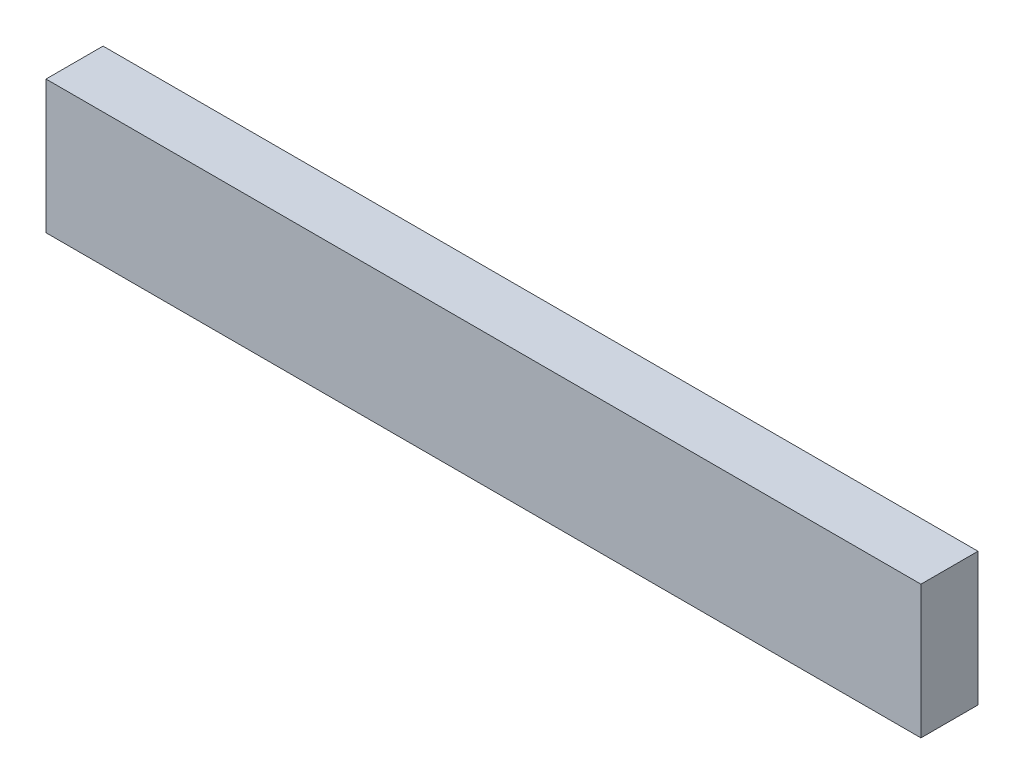
ISO-10303-21;
HEADER;
FILE_DESCRIPTION(('STEP AP214'),'2;1');
FILE_NAME('part.step','',(''),(''),'','','');
FILE_SCHEMA(('AUTOMOTIVE_DESIGN { 1 0 10303 214 1 1 1 1 }'));
ENDSEC;
DATA;
#1=APPLICATION_CONTEXT('core data for automotive mechanical design processes');
#2=APPLICATION_PROTOCOL_DEFINITION('international standard','automotive_design',2000,#1);
#3=PRODUCT_CONTEXT('',#1,'mechanical');
#4=PRODUCT('Part','Part','',(#3));
#5=PRODUCT_RELATED_PRODUCT_CATEGORY('part','',(#4));
#6=PRODUCT_DEFINITION_FORMATION('','',#4);
#7=PRODUCT_DEFINITION_CONTEXT('part definition',#1,'design');
#8=PRODUCT_DEFINITION('design','',#6,#7);
#9=PRODUCT_DEFINITION_SHAPE('','',#8);
#10=(LENGTH_UNIT() NAMED_UNIT(*) SI_UNIT(.MILLI.,.METRE.));
#11=(NAMED_UNIT(*) PLANE_ANGLE_UNIT() SI_UNIT($,.RADIAN.));
#12=(NAMED_UNIT(*) SI_UNIT($,.STERADIAN.) SOLID_ANGLE_UNIT());
#13=UNCERTAINTY_MEASURE_WITH_UNIT(LENGTH_MEASURE(1.E-05),#10,'distance_accuracy_value','');
#14=(GEOMETRIC_REPRESENTATION_CONTEXT(3) GLOBAL_UNCERTAINTY_ASSIGNED_CONTEXT((#13)) GLOBAL_UNIT_ASSIGNED_CONTEXT((#10,
#11,#12)) REPRESENTATION_CONTEXT('',''));
#15=CARTESIAN_POINT('',(0.,0.,0.));
#16=DIRECTION('',(0.,0.,1.));
#17=DIRECTION('',(1.,0.,0.));
#18=AXIS2_PLACEMENT_3D('',#15,#16,#17);
#19=CARTESIAN_POINT('',(584.2,-44.45,-19.05));
#20=DIRECTION('',(0.,0.,1.));
#21=DIRECTION('',(1.,0.,0.));
#22=AXIS2_PLACEMENT_3D('',#19,#20,#21);
#23=PLANE('',#22);
#24=DIRECTION('',(0.,1.,0.));
#25=VECTOR('',#24,1.);
#26=CARTESIAN_POINT('',(0.,-44.45,-19.05));
#27=LINE('',#26,#25);
#28=CARTESIAN_POINT('',(0.,-44.45,-19.05));
#29=VERTEX_POINT('',#28);
#30=CARTESIAN_POINT('',(0.,44.45,-19.05));
#31=VERTEX_POINT('',#30);
#32=EDGE_CURVE('E110',#29,#31,#27,.T.);
#33=ORIENTED_EDGE('',*,*,#32,.T.);
#34=DIRECTION('',(-1.,0.,0.));
#35=VECTOR('',#34,1.);
#36=CARTESIAN_POINT('',(584.2,44.45,-19.05));
#37=LINE('',#36,#35);
#38=CARTESIAN_POINT('',(584.2,44.45,-19.05));
#39=VERTEX_POINT('',#38);
#40=EDGE_CURVE('E11',#39,#31,#37,.T.);
#41=ORIENTED_EDGE('',*,*,#40,.F.);
#42=DIRECTION('',(0.,1.,0.));
#43=VECTOR('',#42,1.);
#44=CARTESIAN_POINT('',(584.2,-44.45,-19.05));
#45=LINE('',#44,#43);
#46=CARTESIAN_POINT('',(584.2,-44.45,-19.05));
#47=VERTEX_POINT('',#46);
#48=EDGE_CURVE('E93',#47,#39,#45,.T.);
#49=ORIENTED_EDGE('',*,*,#48,.F.);
#50=DIRECTION('',(-1.,0.,0.));
#51=VECTOR('',#50,1.);
#52=CARTESIAN_POINT('',(584.2,-44.45,-19.05));
#53=LINE('',#52,#51);
#54=EDGE_CURVE('E106',#47,#29,#53,.T.);
#55=ORIENTED_EDGE('',*,*,#54,.T.);
#56=EDGE_LOOP('',(#33,#41,#49,#55));
#57=FACE_BOUND('',#56,.T.);
#58=ADVANCED_FACE('F41',(#57),#23,.F.);
#59=CARTESIAN_POINT('',(584.2,44.45,19.05));
#60=DIRECTION('',(0.,-1.,0.));
#61=DIRECTION('',(0.,0.,-1.));
#62=AXIS2_PLACEMENT_3D('',#59,#60,#61);
#63=PLANE('',#62);
#64=DIRECTION('',(0.,0.,1.));
#65=VECTOR('',#64,1.);
#66=CARTESIAN_POINT('',(0.,44.45,19.05));
#67=LINE('',#66,#65);
#68=CARTESIAN_POINT('',(0.,44.45,19.05));
#69=VERTEX_POINT('',#68);
#70=EDGE_CURVE('E98',#31,#69,#67,.T.);
#71=ORIENTED_EDGE('',*,*,#70,.T.);
#72=DIRECTION('',(-1.,0.,0.));
#73=VECTOR('',#72,1.);
#74=CARTESIAN_POINT('',(584.2,44.45,19.05));
#75=LINE('',#74,#73);
#76=CARTESIAN_POINT('',(584.2,44.45,19.05));
#77=VERTEX_POINT('',#76);
#78=EDGE_CURVE('E50',#77,#69,#75,.T.);
#79=ORIENTED_EDGE('',*,*,#78,.F.);
#80=DIRECTION('',(0.,0.,1.));
#81=VECTOR('',#80,1.);
#82=CARTESIAN_POINT('',(584.2,44.45,19.05));
#83=LINE('',#82,#81);
#84=EDGE_CURVE('E88',#39,#77,#83,.T.);
#85=ORIENTED_EDGE('',*,*,#84,.F.);
#86=ORIENTED_EDGE('',*,*,#40,.T.);
#87=EDGE_LOOP('',(#71,#79,#85,#86));
#88=FACE_BOUND('',#87,.T.);
#89=ADVANCED_FACE('F97',(#88),#63,.F.);
#90=CARTESIAN_POINT('',(584.2,-44.45,19.05));
#91=DIRECTION('',(0.,0.,-1.));
#92=DIRECTION('',(-1.,0.,0.));
#93=AXIS2_PLACEMENT_3D('',#90,#91,#92);
#94=PLANE('',#93);
#95=DIRECTION('',(0.,-1.,0.));
#96=VECTOR('',#95,1.);
#97=CARTESIAN_POINT('',(0.,-44.45,19.05));
#98=LINE('',#97,#96);
#99=CARTESIAN_POINT('',(0.,-44.45,19.05));
#100=VERTEX_POINT('',#99);
#101=EDGE_CURVE('E75',#69,#100,#98,.T.);
#102=ORIENTED_EDGE('',*,*,#101,.T.);
#103=DIRECTION('',(-1.,0.,0.));
#104=VECTOR('',#103,1.);
#105=CARTESIAN_POINT('',(584.2,-44.45,19.05));
#106=LINE('',#105,#104);
#107=CARTESIAN_POINT('',(584.2,-44.45,19.05));
#108=VERTEX_POINT('',#107);
#109=EDGE_CURVE('E100',#108,#100,#106,.T.);
#110=ORIENTED_EDGE('',*,*,#109,.F.);
#111=DIRECTION('',(0.,-1.,0.));
#112=VECTOR('',#111,1.);
#113=CARTESIAN_POINT('',(584.2,-44.45,19.05));
#114=LINE('',#113,#112);
#115=EDGE_CURVE('E91',#77,#108,#114,.T.);
#116=ORIENTED_EDGE('',*,*,#115,.F.);
#117=ORIENTED_EDGE('',*,*,#78,.T.);
#118=EDGE_LOOP('',(#102,#110,#116,#117));
#119=FACE_BOUND('',#118,.T.);
#120=ADVANCED_FACE('F101',(#119),#94,.F.);
#121=CARTESIAN_POINT('',(584.2,-44.45,19.05));
#122=DIRECTION('',(0.,1.,0.));
#123=DIRECTION('',(0.,0.,1.));
#124=AXIS2_PLACEMENT_3D('',#121,#122,#123);
#125=PLANE('',#124);
#126=DIRECTION('',(0.,0.,-1.));
#127=VECTOR('',#126,1.);
#128=CARTESIAN_POINT('',(0.,-44.45,19.05));
#129=LINE('',#128,#127);
#130=EDGE_CURVE('E81',#100,#29,#129,.T.);
#131=ORIENTED_EDGE('',*,*,#130,.T.);
#132=ORIENTED_EDGE('',*,*,#54,.F.);
#133=DIRECTION('',(0.,0.,-1.));
#134=VECTOR('',#133,1.);
#135=CARTESIAN_POINT('',(584.2,-44.45,19.05));
#136=LINE('',#135,#134);
#137=EDGE_CURVE('E58',#108,#47,#136,.T.);
#138=ORIENTED_EDGE('',*,*,#137,.F.);
#139=ORIENTED_EDGE('',*,*,#109,.T.);
#140=EDGE_LOOP('',(#131,#132,#138,#139));
#141=FACE_BOUND('',#140,.T.);
#142=ADVANCED_FACE('F124',(#141),#125,.F.);
#143=CARTESIAN_POINT('',(584.2,0.,0.));
#144=DIRECTION('',(-1.,0.,0.));
#145=DIRECTION('',(0.,0.,1.));
#146=AXIS2_PLACEMENT_3D('',#143,#144,#145);
#147=PLANE('',#146);
#148=ORIENTED_EDGE('',*,*,#48,.T.);
#149=ORIENTED_EDGE('',*,*,#84,.T.);
#150=ORIENTED_EDGE('',*,*,#115,.T.);
#151=ORIENTED_EDGE('',*,*,#137,.T.);
#152=EDGE_LOOP('',(#148,#149,#150,#151));
#153=FACE_BOUND('',#152,.T.);
#154=ADVANCED_FACE('F89',(#153),#147,.F.);
#155=CARTESIAN_POINT('',(0.,0.,0.));
#156=DIRECTION('',(-1.,0.,0.));
#157=DIRECTION('',(0.,0.,1.));
#158=AXIS2_PLACEMENT_3D('',#155,#156,#157);
#159=PLANE('',#158);
#160=ORIENTED_EDGE('',*,*,#32,.F.);
#161=ORIENTED_EDGE('',*,*,#130,.F.);
#162=ORIENTED_EDGE('',*,*,#101,.F.);
#163=ORIENTED_EDGE('',*,*,#70,.F.);
#164=EDGE_LOOP('',(#160,#161,#162,#163));
#165=FACE_BOUND('',#164,.T.);
#166=ADVANCED_FACE('F127',(#165),#159,.T.);
#167=CLOSED_SHELL('',(#58,#89,#120,#142,#154,#166));
#168=MANIFOLD_SOLID_BREP('B2',#167);
#169=ADVANCED_BREP_SHAPE_REPRESENTATION('',(#18,#168),#14);
#170=SHAPE_DEFINITION_REPRESENTATION(#9,#169);
ENDSEC;
END-ISO-10303-21;
